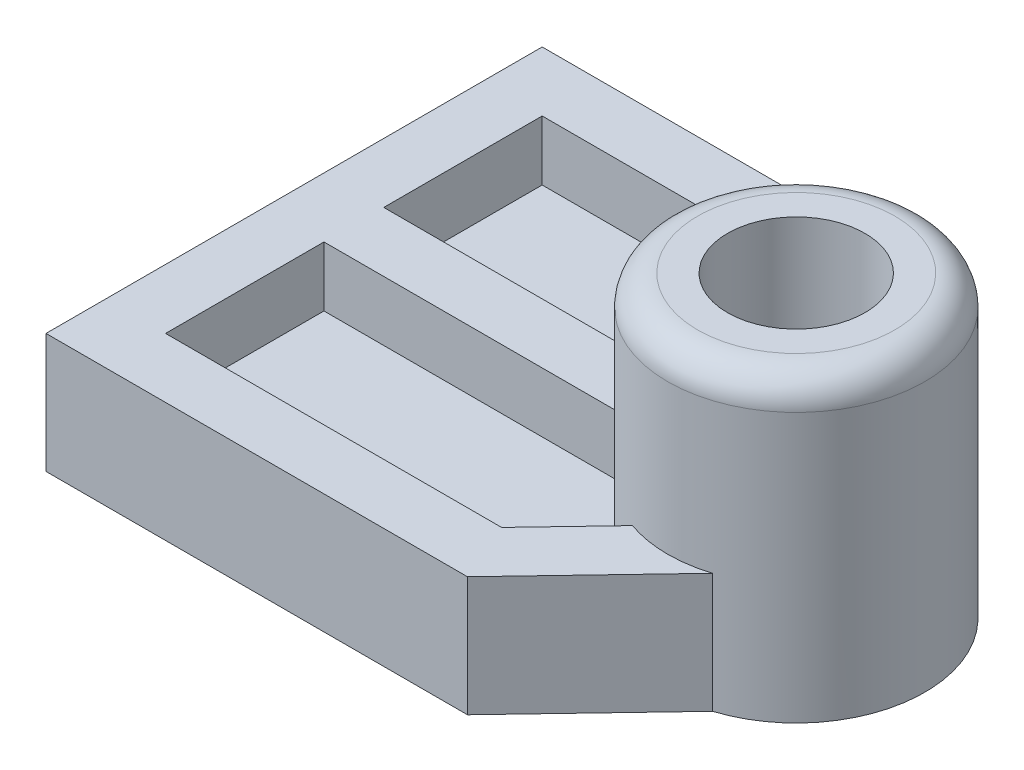
ISO-10303-21;
HEADER;
FILE_DESCRIPTION(('STEP AP214'),'2;1');
FILE_NAME('part.step','',(''),(''),'','','');
FILE_SCHEMA(('AUTOMOTIVE_DESIGN { 1 0 10303 214 1 1 1 1 }'));
ENDSEC;
DATA;
#1=APPLICATION_CONTEXT('core data for automotive mechanical design processes');
#2=APPLICATION_PROTOCOL_DEFINITION('international standard','automotive_design',2000,#1);
#3=PRODUCT_CONTEXT('',#1,'mechanical');
#4=PRODUCT('Part','Part','',(#3));
#5=PRODUCT_RELATED_PRODUCT_CATEGORY('part','',(#4));
#6=PRODUCT_DEFINITION_FORMATION('','',#4);
#7=PRODUCT_DEFINITION_CONTEXT('part definition',#1,'design');
#8=PRODUCT_DEFINITION('design','',#6,#7);
#9=PRODUCT_DEFINITION_SHAPE('','',#8);
#10=(LENGTH_UNIT() NAMED_UNIT(*) SI_UNIT(.MILLI.,.METRE.));
#11=(NAMED_UNIT(*) PLANE_ANGLE_UNIT() SI_UNIT($,.RADIAN.));
#12=(NAMED_UNIT(*) SI_UNIT($,.STERADIAN.) SOLID_ANGLE_UNIT());
#13=UNCERTAINTY_MEASURE_WITH_UNIT(LENGTH_MEASURE(1.E-05),#10,'distance_accuracy_value','');
#14=(GEOMETRIC_REPRESENTATION_CONTEXT(3) GLOBAL_UNCERTAINTY_ASSIGNED_CONTEXT((#13)) GLOBAL_UNIT_ASSIGNED_CONTEXT((#10,
#11,#12)) REPRESENTATION_CONTEXT('',''));
#15=CARTESIAN_POINT('',(0.,0.,0.));
#16=DIRECTION('',(0.,0.,1.));
#17=DIRECTION('',(1.,0.,0.));
#18=AXIS2_PLACEMENT_3D('',#15,#16,#17);
#19=CARTESIAN_POINT('',(0.,2.,0.));
#20=DIRECTION('',(0.,1.,0.));
#21=DIRECTION('',(0.,0.,1.));
#22=AXIS2_PLACEMENT_3D('',#19,#20,#21);
#23=PLANE('',#22);
#24=CARTESIAN_POINT('',(3.1,2.,0.));
#25=DIRECTION('',(0.,1.,0.));
#26=DIRECTION('',(0.,0.,1.));
#27=AXIS2_PLACEMENT_3D('',#24,#25,#26);
#28=CIRCLE('',#27,2.15);
#29=CARTESIAN_POINT('',(1.00894763336735,2.,-0.499999999999999));
#30=VERTEX_POINT('',#29);
#31=CARTESIAN_POINT('',(1.00894763336735,2.,0.499999999999999));
#32=VERTEX_POINT('',#31);
#33=EDGE_CURVE('E235',#30,#32,#28,.T.);
#34=ORIENTED_EDGE('',*,*,#33,.F.);
#35=DIRECTION('',(-1.,0.,0.));
#36=VECTOR('',#35,1.);
#37=CARTESIAN_POINT('',(0.,2.,-0.5));
#38=LINE('',#37,#36);
#39=CARTESIAN_POINT('',(-4.3,2.,-0.499999999999999));
#40=VERTEX_POINT('',#39);
#41=EDGE_CURVE('E56',#30,#40,#38,.T.);
#42=ORIENTED_EDGE('',*,*,#41,.T.);
#43=DIRECTION('',(0.,0.,1.));
#44=VECTOR('',#43,1.);
#45=CARTESIAN_POINT('',(-4.3,2.,0.));
#46=LINE('',#45,#44);
#47=CARTESIAN_POINT('',(-4.3,2.,-3.15));
#48=VERTEX_POINT('',#47);
#49=EDGE_CURVE('E163',#48,#40,#46,.T.);
#50=ORIENTED_EDGE('',*,*,#49,.F.);
#51=DIRECTION('',(1.,0.,0.));
#52=VECTOR('',#51,1.);
#53=CARTESIAN_POINT('',(0.,2.,-3.15));
#54=LINE('',#53,#52);
#55=CARTESIAN_POINT('',(1.32175815821047,2.,-3.15));
#56=VERTEX_POINT('',#55);
#57=EDGE_CURVE('E181',#48,#56,#54,.T.);
#58=ORIENTED_EDGE('',*,*,#57,.T.);
#59=DIRECTION('',(0.689550160177991,0.,0.724237928168987));
#60=VECTOR('',#59,1.);
#61=CARTESIAN_POINT('',(2.26639424630242,2.,-2.15784406585188));
#62=LINE('',#61,#60);
#63=CARTESIAN_POINT('',(2.38902615278775,2.,-2.02904317070392));
#64=VERTEX_POINT('',#63);
#65=EDGE_CURVE('E177',#56,#64,#62,.T.);
#66=ORIENTED_EDGE('',*,*,#65,.T.);
#67=CARTESIAN_POINT('',(3.75,2.,-2.04939015319192));
#68=VERTEX_POINT('',#67);
#69=EDGE_CURVE('E232',#68,#64,#28,.T.);
#70=ORIENTED_EDGE('',*,*,#69,.F.);
#71=DIRECTION('',(-0.689550160177991,0.,-0.724237928168987));
#72=VECTOR('',#71,1.);
#73=CARTESIAN_POINT('',(2.99041428345738,2.,-2.84718677102402));
#74=LINE('',#73,#72);
#75=CARTESIAN_POINT('',(1.75,2.,-4.15));
#76=VERTEX_POINT('',#75);
#77=EDGE_CURVE('E234',#68,#76,#74,.T.);
#78=ORIENTED_EDGE('',*,*,#77,.T.);
#79=DIRECTION('',(-1.,0.,0.));
#80=VECTOR('',#79,1.);
#81=CARTESIAN_POINT('',(0.,2.,-4.15));
#82=LINE('',#81,#80);
#83=CARTESIAN_POINT('',(-5.3,2.,-4.15));
#84=VERTEX_POINT('',#83);
#85=EDGE_CURVE('E237',#76,#84,#82,.T.);
#86=ORIENTED_EDGE('',*,*,#85,.T.);
#87=DIRECTION('',(0.,0.,1.));
#88=VECTOR('',#87,1.);
#89=CARTESIAN_POINT('',(-5.3,2.,0.));
#90=LINE('',#89,#88);
#91=CARTESIAN_POINT('',(-5.3,2.,4.15));
#92=VERTEX_POINT('',#91);
#93=EDGE_CURVE('E239',#84,#92,#90,.T.);
#94=ORIENTED_EDGE('',*,*,#93,.T.);
#95=DIRECTION('',(1.,0.,0.));
#96=VECTOR('',#95,1.);
#97=CARTESIAN_POINT('',(0.,2.,4.15));
#98=LINE('',#97,#96);
#99=CARTESIAN_POINT('',(1.75,2.,4.15));
#100=VERTEX_POINT('',#99);
#101=EDGE_CURVE('E241',#92,#100,#98,.T.);
#102=ORIENTED_EDGE('',*,*,#101,.T.);
#103=DIRECTION('',(0.689550160177991,0.,-0.724237928168987));
#104=VECTOR('',#103,1.);
#105=CARTESIAN_POINT('',(2.99041428345738,2.,2.84718677102402));
#106=LINE('',#105,#104);
#107=CARTESIAN_POINT('',(3.75,2.,2.04939015319192));
#108=VERTEX_POINT('',#107);
#109=EDGE_CURVE('E243',#100,#108,#106,.T.);
#110=ORIENTED_EDGE('',*,*,#109,.T.);
#111=CARTESIAN_POINT('',(2.38902615278775,2.,2.02904317070392));
#112=VERTEX_POINT('',#111);
#113=EDGE_CURVE('E229',#112,#108,#28,.T.);
#114=ORIENTED_EDGE('',*,*,#113,.F.);
#115=DIRECTION('',(0.689550160177991,0.,-0.724237928168988));
#116=VECTOR('',#115,1.);
#117=CARTESIAN_POINT('',(2.26639424630242,2.,2.15784406585188));
#118=LINE('',#117,#116);
#119=CARTESIAN_POINT('',(1.32175815821047,2.,3.15));
#120=VERTEX_POINT('',#119);
#121=EDGE_CURVE('E197',#120,#112,#118,.T.);
#122=ORIENTED_EDGE('',*,*,#121,.F.);
#123=DIRECTION('',(-1.,0.,0.));
#124=VECTOR('',#123,1.);
#125=CARTESIAN_POINT('',(0.,2.,3.15));
#126=LINE('',#125,#124);
#127=CARTESIAN_POINT('',(-4.3,2.,3.15));
#128=VERTEX_POINT('',#127);
#129=EDGE_CURVE('E213',#120,#128,#126,.T.);
#130=ORIENTED_EDGE('',*,*,#129,.T.);
#131=DIRECTION('',(0.,0.,1.));
#132=VECTOR('',#131,1.);
#133=CARTESIAN_POINT('',(-4.3,2.,0.));
#134=LINE('',#133,#132);
#135=CARTESIAN_POINT('',(-4.3,2.,0.500000000000001));
#136=VERTEX_POINT('',#135);
#137=EDGE_CURVE('E210',#136,#128,#134,.T.);
#138=ORIENTED_EDGE('',*,*,#137,.F.);
#139=DIRECTION('',(1.,0.,0.));
#140=VECTOR('',#139,1.);
#141=CARTESIAN_POINT('',(0.,2.,0.499999999999999));
#142=LINE('',#141,#140);
#143=EDGE_CURVE('E48',#136,#32,#142,.T.);
#144=ORIENTED_EDGE('',*,*,#143,.T.);
#145=EDGE_LOOP('',(#34,#42,#50,#58,#66,#70,#78,#86,#94,#102,#110,#114,#122,#130,#138,#144));
#146=FACE_BOUND('',#145,.T.);
#147=ADVANCED_FACE('F33',(#146),#23,.T.);
#148=CARTESIAN_POINT('',(0.,5.,0.));
#149=DIRECTION('',(0.,1.,0.));
#150=DIRECTION('',(0.,0.,1.));
#151=AXIS2_PLACEMENT_3D('',#148,#149,#150);
#152=PLANE('',#151);
#153=CARTESIAN_POINT('',(3.1,5.,0.));
#154=DIRECTION('',(0.,1.,0.));
#155=DIRECTION('',(0.,0.,1.));
#156=AXIS2_PLACEMENT_3D('',#153,#154,#155);
#157=CIRCLE('',#156,1.65);
#158=CARTESIAN_POINT('',(3.1,5.,1.65));
#159=VERTEX_POINT('',#158);
#160=EDGE_CURVE('E41',#159,#159,#157,.T.);
#161=ORIENTED_EDGE('',*,*,#160,.T.);
#162=EDGE_LOOP('',(#161));
#163=FACE_BOUND('',#162,.T.);
#164=CARTESIAN_POINT('',(3.1,5.,0.));
#165=DIRECTION('',(0.,1.,0.));
#166=DIRECTION('',(0.,0.,1.));
#167=AXIS2_PLACEMENT_3D('',#164,#165,#166);
#168=CIRCLE('',#167,1.15);
#169=CARTESIAN_POINT('',(3.1,5.,1.15));
#170=VERTEX_POINT('',#169);
#171=EDGE_CURVE('E188',#170,#170,#168,.T.);
#172=ORIENTED_EDGE('',*,*,#171,.F.);
#173=EDGE_LOOP('',(#172));
#174=FACE_BOUND('',#173,.T.);
#175=ADVANCED_FACE('F281',(#163,#174),#152,.T.);
#176=CARTESIAN_POINT('',(-5.25,5.,4.15));
#177=DIRECTION('',(0.,0.,-1.));
#178=DIRECTION('',(-1.,0.,0.));
#179=AXIS2_PLACEMENT_3D('',#176,#177,#178);
#180=PLANE('',#179);
#181=ORIENTED_EDGE('',*,*,#101,.F.);
#182=DIRECTION('',(0.,1.,0.));
#183=VECTOR('',#182,1.);
#184=CARTESIAN_POINT('',(-5.3,0.,4.15));
#185=LINE('',#184,#183);
#186=CARTESIAN_POINT('',(-5.3,0.,4.15));
#187=VERTEX_POINT('',#186);
#188=EDGE_CURVE('E251',#187,#92,#185,.T.);
#189=ORIENTED_EDGE('',*,*,#188,.F.);
#190=DIRECTION('',(1.,0.,0.));
#191=VECTOR('',#190,1.);
#192=CARTESIAN_POINT('',(-5.25,0.,4.15));
#193=LINE('',#192,#191);
#194=CARTESIAN_POINT('',(1.75,0.,4.15));
#195=VERTEX_POINT('',#194);
#196=EDGE_CURVE('E269',#187,#195,#193,.T.);
#197=ORIENTED_EDGE('',*,*,#196,.T.);
#198=DIRECTION('',(0.,-1.,0.));
#199=VECTOR('',#198,1.);
#200=CARTESIAN_POINT('',(1.75,5.,4.15));
#201=LINE('',#200,#199);
#202=EDGE_CURVE('E277',#100,#195,#201,.T.);
#203=ORIENTED_EDGE('',*,*,#202,.F.);
#204=EDGE_LOOP('',(#181,#189,#197,#203));
#205=FACE_BOUND('',#204,.T.);
#206=ADVANCED_FACE('F298',(#205),#180,.F.);
#207=CARTESIAN_POINT('',(-5.25,5.,-4.15));
#208=DIRECTION('',(0.,0.,1.));
#209=DIRECTION('',(1.,0.,0.));
#210=AXIS2_PLACEMENT_3D('',#207,#208,#209);
#211=PLANE('',#210);
#212=ORIENTED_EDGE('',*,*,#85,.F.);
#213=DIRECTION('',(0.,1.,0.));
#214=VECTOR('',#213,1.);
#215=CARTESIAN_POINT('',(1.75,-5.,-4.15));
#216=LINE('',#215,#214);
#217=CARTESIAN_POINT('',(1.75,0.,-4.15));
#218=VERTEX_POINT('',#217);
#219=EDGE_CURVE('E260',#218,#76,#216,.T.);
#220=ORIENTED_EDGE('',*,*,#219,.F.);
#221=DIRECTION('',(-1.,0.,0.));
#222=VECTOR('',#221,1.);
#223=CARTESIAN_POINT('',(-5.25,0.,-4.15));
#224=LINE('',#223,#222);
#225=CARTESIAN_POINT('',(-5.3,0.,-4.15));
#226=VERTEX_POINT('',#225);
#227=EDGE_CURVE('E264',#218,#226,#224,.T.);
#228=ORIENTED_EDGE('',*,*,#227,.T.);
#229=DIRECTION('',(0.,-1.,0.));
#230=VECTOR('',#229,1.);
#231=CARTESIAN_POINT('',(-5.3,0.,-4.15));
#232=LINE('',#231,#230);
#233=EDGE_CURVE('E246',#84,#226,#232,.T.);
#234=ORIENTED_EDGE('',*,*,#233,.F.);
#235=EDGE_LOOP('',(#212,#220,#228,#234));
#236=FACE_BOUND('',#235,.T.);
#237=ADVANCED_FACE('F316',(#236),#211,.F.);
#238=CARTESIAN_POINT('',(2.99041428345738,-5.,-2.84718677102402));
#239=DIRECTION('',(-0.724237928168987,0.,0.689550160177991));
#240=DIRECTION('',(0.689550160177991,0.,0.724237928168987));
#241=AXIS2_PLACEMENT_3D('',#238,#239,#240);
#242=PLANE('',#241);
#243=ORIENTED_EDGE('',*,*,#77,.F.);
#244=DIRECTION('',(0.,1.,0.));
#245=VECTOR('',#244,1.);
#246=CARTESIAN_POINT('',(3.75,-5.,-2.04939015319192));
#247=LINE('',#246,#245);
#248=CARTESIAN_POINT('',(3.75,0.,-2.04939015319192));
#249=VERTEX_POINT('',#248);
#250=EDGE_CURVE('E261',#249,#68,#247,.T.);
#251=ORIENTED_EDGE('',*,*,#250,.F.);
#252=DIRECTION('',(0.689550160177991,0.,0.724237928168987));
#253=VECTOR('',#252,1.);
#254=CARTESIAN_POINT('',(2.99041428345738,0.,-2.84718677102402));
#255=LINE('',#254,#253);
#256=EDGE_CURVE('E272',#218,#249,#255,.T.);
#257=ORIENTED_EDGE('',*,*,#256,.F.);
#258=ORIENTED_EDGE('',*,*,#219,.T.);
#259=EDGE_LOOP('',(#243,#251,#257,#258));
#260=FACE_BOUND('',#259,.T.);
#261=ADVANCED_FACE('F312',(#260),#242,.F.);
#262=CARTESIAN_POINT('',(2.99041428345738,-5.,2.84718677102402));
#263=DIRECTION('',(0.724237928168987,0.,0.689550160177991));
#264=DIRECTION('',(0.689550160177991,0.,-0.724237928168987));
#265=AXIS2_PLACEMENT_3D('',#262,#263,#264);
#266=PLANE('',#265);
#267=DIRECTION('',(0.,1.,0.));
#268=VECTOR('',#267,1.);
#269=CARTESIAN_POINT('',(3.75,-5.,2.04939015319192));
#270=LINE('',#269,#268);
#271=CARTESIAN_POINT('',(3.75,0.,2.04939015319192));
#272=VERTEX_POINT('',#271);
#273=EDGE_CURVE('E254',#272,#108,#270,.T.);
#274=ORIENTED_EDGE('',*,*,#273,.T.);
#275=ORIENTED_EDGE('',*,*,#109,.F.);
#276=ORIENTED_EDGE('',*,*,#202,.T.);
#277=DIRECTION('',(0.689550160177991,0.,-0.724237928168987));
#278=VECTOR('',#277,1.);
#279=CARTESIAN_POINT('',(2.99041428345738,0.,2.84718677102402));
#280=LINE('',#279,#278);
#281=EDGE_CURVE('E257',#195,#272,#280,.T.);
#282=ORIENTED_EDGE('',*,*,#281,.T.);
#283=EDGE_LOOP('',(#274,#275,#276,#282));
#284=FACE_BOUND('',#283,.T.);
#285=ADVANCED_FACE('F308',(#284),#266,.T.);
#286=CARTESIAN_POINT('',(-5.3,0.,0.));
#287=DIRECTION('',(1.,0.,0.));
#288=DIRECTION('',(0.,0.,-1.));
#289=AXIS2_PLACEMENT_3D('',#286,#287,#288);
#290=PLANE('',#289);
#291=ORIENTED_EDGE('',*,*,#93,.F.);
#292=ORIENTED_EDGE('',*,*,#233,.T.);
#293=DIRECTION('',(0.,0.,1.));
#294=VECTOR('',#293,1.);
#295=CARTESIAN_POINT('',(-5.3,0.,-4.15));
#296=LINE('',#295,#294);
#297=EDGE_CURVE('E248',#226,#187,#296,.T.);
#298=ORIENTED_EDGE('',*,*,#297,.T.);
#299=ORIENTED_EDGE('',*,*,#188,.T.);
#300=EDGE_LOOP('',(#291,#292,#298,#299));
#301=FACE_BOUND('',#300,.T.);
#302=ADVANCED_FACE('F304',(#301),#290,.F.);
#303=CARTESIAN_POINT('',(0.,0.,0.));
#304=DIRECTION('',(0.,1.,0.));
#305=DIRECTION('',(0.,0.,1.));
#306=AXIS2_PLACEMENT_3D('',#303,#304,#305);
#307=PLANE('',#306);
#308=CARTESIAN_POINT('',(3.1,0.,0.));
#309=DIRECTION('',(0.,1.,0.));
#310=DIRECTION('',(0.,0.,1.));
#311=AXIS2_PLACEMENT_3D('',#308,#309,#310);
#312=CIRCLE('',#311,1.15);
#313=CARTESIAN_POINT('',(3.1,0.,1.15));
#314=VERTEX_POINT('',#313);
#315=EDGE_CURVE('E226',#314,#314,#312,.T.);
#316=ORIENTED_EDGE('',*,*,#315,.T.);
#317=EDGE_LOOP('',(#316));
#318=FACE_BOUND('',#317,.T.);
#319=CARTESIAN_POINT('',(3.1,0.,0.));
#320=DIRECTION('',(0.,1.,0.));
#321=DIRECTION('',(0.,0.,1.));
#322=AXIS2_PLACEMENT_3D('',#319,#320,#321);
#323=CIRCLE('',#322,2.15);
#324=EDGE_CURVE('E275',#272,#249,#323,.T.);
#325=ORIENTED_EDGE('',*,*,#324,.F.);
#326=ORIENTED_EDGE('',*,*,#281,.F.);
#327=ORIENTED_EDGE('',*,*,#196,.F.);
#328=ORIENTED_EDGE('',*,*,#297,.F.);
#329=ORIENTED_EDGE('',*,*,#227,.F.);
#330=ORIENTED_EDGE('',*,*,#256,.T.);
#331=EDGE_LOOP('',(#325,#326,#327,#328,#329,#330));
#332=FACE_BOUND('',#331,.T.);
#333=ADVANCED_FACE('F307',(#318,#332),#307,.F.);
#334=CARTESIAN_POINT('',(3.1,-5.,0.));
#335=DIRECTION('',(0.,1.,0.));
#336=DIRECTION('',(0.,0.,1.));
#337=AXIS2_PLACEMENT_3D('',#334,#335,#336);
#338=CYLINDRICAL_SURFACE('',#337,2.15);
#339=CARTESIAN_POINT('',(3.1,4.5,0.));
#340=DIRECTION('',(0.,1.,0.));
#341=DIRECTION('',(0.,0.,1.));
#342=AXIS2_PLACEMENT_3D('',#339,#340,#341);
#343=CIRCLE('',#342,2.15);
#344=CARTESIAN_POINT('',(3.1,4.5,2.15));
#345=VERTEX_POINT('',#344);
#346=EDGE_CURVE('E11',#345,#345,#343,.F.);
#347=ORIENTED_EDGE('',*,*,#346,.T.);
#348=EDGE_LOOP('',(#347));
#349=FACE_BOUND('',#348,.T.);
#350=ORIENTED_EDGE('',*,*,#324,.T.);
#351=ORIENTED_EDGE('',*,*,#250,.T.);
#352=ORIENTED_EDGE('',*,*,#69,.T.);
#353=DIRECTION('',(0.,1.,0.));
#354=VECTOR('',#353,1.);
#355=CARTESIAN_POINT('',(2.38902615278775,1.,-2.02904317070392));
#356=LINE('',#355,#354);
#357=CARTESIAN_POINT('',(2.38902615278775,1.,-2.02904317070392));
#358=VERTEX_POINT('',#357);
#359=EDGE_CURVE('E152',#358,#64,#356,.T.);
#360=ORIENTED_EDGE('',*,*,#359,.F.);
#361=CARTESIAN_POINT('',(3.1,1.,0.));
#362=DIRECTION('',(0.,1.,0.));
#363=DIRECTION('',(0.,0.,1.));
#364=AXIS2_PLACEMENT_3D('',#361,#362,#363);
#365=CIRCLE('',#364,2.15);
#366=CARTESIAN_POINT('',(1.00894763336735,1.,-0.499999999999999));
#367=VERTEX_POINT('',#366);
#368=EDGE_CURVE('E160',#367,#358,#365,.F.);
#369=ORIENTED_EDGE('',*,*,#368,.F.);
#370=DIRECTION('',(0.,1.,0.));
#371=VECTOR('',#370,1.);
#372=CARTESIAN_POINT('',(1.00894763336735,1.,-0.499999999999999));
#373=LINE('',#372,#371);
#374=EDGE_CURVE('E143',#367,#30,#373,.T.);
#375=ORIENTED_EDGE('',*,*,#374,.T.);
#376=ORIENTED_EDGE('',*,*,#33,.T.);
#377=DIRECTION('',(0.,1.,0.));
#378=VECTOR('',#377,1.);
#379=CARTESIAN_POINT('',(1.00894763336735,1.,0.499999999999999));
#380=LINE('',#379,#378);
#381=CARTESIAN_POINT('',(1.00894763336735,1.,0.499999999999999));
#382=VERTEX_POINT('',#381);
#383=EDGE_CURVE('E178',#382,#32,#380,.T.);
#384=ORIENTED_EDGE('',*,*,#383,.F.);
#385=CARTESIAN_POINT('',(3.1,1.,0.));
#386=DIRECTION('',(0.,1.,0.));
#387=DIRECTION('',(0.,0.,1.));
#388=AXIS2_PLACEMENT_3D('',#385,#386,#387);
#389=CIRCLE('',#388,2.15);
#390=CARTESIAN_POINT('',(2.38902615278775,1.,2.02904317070392));
#391=VERTEX_POINT('',#390);
#392=EDGE_CURVE('E205',#391,#382,#389,.F.);
#393=ORIENTED_EDGE('',*,*,#392,.F.);
#394=DIRECTION('',(0.,1.,0.));
#395=VECTOR('',#394,1.);
#396=CARTESIAN_POINT('',(2.38902615278775,1.,2.02904317070392));
#397=LINE('',#396,#395);
#398=EDGE_CURVE('E219',#391,#112,#397,.T.);
#399=ORIENTED_EDGE('',*,*,#398,.T.);
#400=ORIENTED_EDGE('',*,*,#113,.T.);
#401=ORIENTED_EDGE('',*,*,#273,.F.);
#402=EDGE_LOOP('',(#350,#351,#352,#360,#369,#375,#376,#384,#393,#399,#400,#401));
#403=FACE_BOUND('',#402,.T.);
#404=ADVANCED_FACE('F167',(#349,#403),#338,.T.);
#405=CARTESIAN_POINT('',(3.1,0.,0.));
#406=DIRECTION('',(0.,1.,0.));
#407=DIRECTION('',(0.,0.,1.));
#408=AXIS2_PLACEMENT_3D('',#405,#406,#407);
#409=CYLINDRICAL_SURFACE('',#408,1.15);
#410=ORIENTED_EDGE('',*,*,#315,.F.);
#411=EDGE_LOOP('',(#410));
#412=FACE_BOUND('',#411,.T.);
#413=ORIENTED_EDGE('',*,*,#171,.T.);
#414=EDGE_LOOP('',(#413));
#415=FACE_BOUND('',#414,.T.);
#416=ADVANCED_FACE('F302',(#412,#415),#409,.F.);
#417=CARTESIAN_POINT('',(0.,1.,0.499999999999999));
#418=DIRECTION('',(0.,0.,1.));
#419=DIRECTION('',(1.,0.,0.));
#420=AXIS2_PLACEMENT_3D('',#417,#418,#419);
#421=PLANE('',#420);
#422=ORIENTED_EDGE('',*,*,#143,.F.);
#423=DIRECTION('',(0.,1.,0.));
#424=VECTOR('',#423,1.);
#425=CARTESIAN_POINT('',(-4.3,1.,0.500000000000001));
#426=LINE('',#425,#424);
#427=CARTESIAN_POINT('',(-4.3,1.,0.500000000000001));
#428=VERTEX_POINT('',#427);
#429=EDGE_CURVE('E208',#428,#136,#426,.T.);
#430=ORIENTED_EDGE('',*,*,#429,.F.);
#431=DIRECTION('',(1.,0.,0.));
#432=VECTOR('',#431,1.);
#433=CARTESIAN_POINT('',(0.,1.,0.499999999999999));
#434=LINE('',#433,#432);
#435=EDGE_CURVE('E194',#428,#382,#434,.T.);
#436=ORIENTED_EDGE('',*,*,#435,.T.);
#437=ORIENTED_EDGE('',*,*,#383,.T.);
#438=EDGE_LOOP('',(#422,#430,#436,#437));
#439=FACE_BOUND('',#438,.T.);
#440=ADVANCED_FACE('F356',(#439),#421,.T.);
#441=CARTESIAN_POINT('',(2.26639424630242,1.,2.15784406585188));
#442=DIRECTION('',(0.724237928168988,0.,0.689550160177991));
#443=DIRECTION('',(0.689550160177991,0.,-0.724237928168988));
#444=AXIS2_PLACEMENT_3D('',#441,#442,#443);
#445=PLANE('',#444);
#446=ORIENTED_EDGE('',*,*,#121,.T.);
#447=ORIENTED_EDGE('',*,*,#398,.F.);
#448=DIRECTION('',(0.689550160177991,0.,-0.724237928168988));
#449=VECTOR('',#448,1.);
#450=CARTESIAN_POINT('',(2.26639424630242,1.,2.15784406585188));
#451=LINE('',#450,#449);
#452=CARTESIAN_POINT('',(1.32175815821047,1.,3.15));
#453=VERTEX_POINT('',#452);
#454=EDGE_CURVE('E202',#453,#391,#451,.T.);
#455=ORIENTED_EDGE('',*,*,#454,.F.);
#456=DIRECTION('',(0.,1.,0.));
#457=VECTOR('',#456,1.);
#458=CARTESIAN_POINT('',(1.32175815821047,1.,3.15));
#459=LINE('',#458,#457);
#460=EDGE_CURVE('E221',#453,#120,#459,.T.);
#461=ORIENTED_EDGE('',*,*,#460,.T.);
#462=EDGE_LOOP('',(#446,#447,#455,#461));
#463=FACE_BOUND('',#462,.T.);
#464=ADVANCED_FACE('F362',(#463),#445,.F.);
#465=CARTESIAN_POINT('',(0.,1.,3.15));
#466=DIRECTION('',(0.,0.,-1.));
#467=DIRECTION('',(-1.,0.,0.));
#468=AXIS2_PLACEMENT_3D('',#465,#466,#467);
#469=PLANE('',#468);
#470=ORIENTED_EDGE('',*,*,#129,.F.);
#471=ORIENTED_EDGE('',*,*,#460,.F.);
#472=DIRECTION('',(-1.,0.,0.));
#473=VECTOR('',#472,1.);
#474=CARTESIAN_POINT('',(0.,1.,3.15));
#475=LINE('',#474,#473);
#476=CARTESIAN_POINT('',(-4.3,1.,3.15));
#477=VERTEX_POINT('',#476);
#478=EDGE_CURVE('E200',#453,#477,#475,.T.);
#479=ORIENTED_EDGE('',*,*,#478,.T.);
#480=DIRECTION('',(0.,1.,0.));
#481=VECTOR('',#480,1.);
#482=CARTESIAN_POINT('',(-4.3,1.,3.15));
#483=LINE('',#482,#481);
#484=EDGE_CURVE('E223',#477,#128,#483,.T.);
#485=ORIENTED_EDGE('',*,*,#484,.T.);
#486=EDGE_LOOP('',(#470,#471,#479,#485));
#487=FACE_BOUND('',#486,.T.);
#488=ADVANCED_FACE('F364',(#487),#469,.T.);
#489=CARTESIAN_POINT('',(-4.3,1.,0.));
#490=DIRECTION('',(-1.,0.,0.));
#491=DIRECTION('',(0.,0.,1.));
#492=AXIS2_PLACEMENT_3D('',#489,#490,#491);
#493=PLANE('',#492);
#494=ORIENTED_EDGE('',*,*,#137,.T.);
#495=ORIENTED_EDGE('',*,*,#484,.F.);
#496=DIRECTION('',(0.,0.,1.));
#497=VECTOR('',#496,1.);
#498=CARTESIAN_POINT('',(-4.3,1.,0.));
#499=LINE('',#498,#497);
#500=EDGE_CURVE('E196',#428,#477,#499,.T.);
#501=ORIENTED_EDGE('',*,*,#500,.F.);
#502=ORIENTED_EDGE('',*,*,#429,.T.);
#503=EDGE_LOOP('',(#494,#495,#501,#502));
#504=FACE_BOUND('',#503,.T.);
#505=ADVANCED_FACE('F353',(#504),#493,.F.);
#506=CARTESIAN_POINT('',(0.,1.,0.));
#507=DIRECTION('',(0.,1.,0.));
#508=DIRECTION('',(0.,0.,1.));
#509=AXIS2_PLACEMENT_3D('',#506,#507,#508);
#510=PLANE('',#509);
#511=ORIENTED_EDGE('',*,*,#435,.F.);
#512=ORIENTED_EDGE('',*,*,#500,.T.);
#513=ORIENTED_EDGE('',*,*,#478,.F.);
#514=ORIENTED_EDGE('',*,*,#454,.T.);
#515=ORIENTED_EDGE('',*,*,#392,.T.);
#516=EDGE_LOOP('',(#511,#512,#513,#514,#515));
#517=FACE_BOUND('',#516,.T.);
#518=ADVANCED_FACE('F358',(#517),#510,.T.);
#519=CARTESIAN_POINT('',(0.,1.,-0.5));
#520=DIRECTION('',(0.,0.,-1.));
#521=DIRECTION('',(-1.,0.,0.));
#522=AXIS2_PLACEMENT_3D('',#519,#520,#521);
#523=PLANE('',#522);
#524=ORIENTED_EDGE('',*,*,#41,.F.);
#525=ORIENTED_EDGE('',*,*,#374,.F.);
#526=DIRECTION('',(-1.,0.,0.));
#527=VECTOR('',#526,1.);
#528=CARTESIAN_POINT('',(0.,1.,-0.5));
#529=LINE('',#528,#527);
#530=CARTESIAN_POINT('',(-4.3,1.,-0.499999999999999));
#531=VERTEX_POINT('',#530);
#532=EDGE_CURVE('E146',#367,#531,#529,.T.);
#533=ORIENTED_EDGE('',*,*,#532,.T.);
#534=DIRECTION('',(0.,1.,0.));
#535=VECTOR('',#534,1.);
#536=CARTESIAN_POINT('',(-4.3,1.,-0.499999999999999));
#537=LINE('',#536,#535);
#538=EDGE_CURVE('E186',#531,#40,#537,.T.);
#539=ORIENTED_EDGE('',*,*,#538,.T.);
#540=EDGE_LOOP('',(#524,#525,#533,#539));
#541=FACE_BOUND('',#540,.T.);
#542=ADVANCED_FACE('F145',(#541),#523,.T.);
#543=CARTESIAN_POINT('',(-4.3,1.,0.));
#544=DIRECTION('',(-1.,0.,0.));
#545=DIRECTION('',(0.,0.,1.));
#546=AXIS2_PLACEMENT_3D('',#543,#544,#545);
#547=PLANE('',#546);
#548=ORIENTED_EDGE('',*,*,#49,.T.);
#549=ORIENTED_EDGE('',*,*,#538,.F.);
#550=DIRECTION('',(0.,0.,1.));
#551=VECTOR('',#550,1.);
#552=CARTESIAN_POINT('',(-4.3,1.,0.));
#553=LINE('',#552,#551);
#554=CARTESIAN_POINT('',(-4.3,1.,-3.15));
#555=VERTEX_POINT('',#554);
#556=EDGE_CURVE('E153',#555,#531,#553,.T.);
#557=ORIENTED_EDGE('',*,*,#556,.F.);
#558=DIRECTION('',(0.,1.,0.));
#559=VECTOR('',#558,1.);
#560=CARTESIAN_POINT('',(-4.3,1.,-3.15));
#561=LINE('',#560,#559);
#562=EDGE_CURVE('E189',#555,#48,#561,.T.);
#563=ORIENTED_EDGE('',*,*,#562,.T.);
#564=EDGE_LOOP('',(#548,#549,#557,#563));
#565=FACE_BOUND('',#564,.T.);
#566=ADVANCED_FACE('F450',(#565),#547,.F.);
#567=CARTESIAN_POINT('',(0.,1.,-3.15));
#568=DIRECTION('',(0.,0.,1.));
#569=DIRECTION('',(1.,0.,0.));
#570=AXIS2_PLACEMENT_3D('',#567,#568,#569);
#571=PLANE('',#570);
#572=ORIENTED_EDGE('',*,*,#57,.F.);
#573=ORIENTED_EDGE('',*,*,#562,.F.);
#574=DIRECTION('',(1.,0.,0.));
#575=VECTOR('',#574,1.);
#576=CARTESIAN_POINT('',(0.,1.,-3.15));
#577=LINE('',#576,#575);
#578=CARTESIAN_POINT('',(1.32175815821047,1.,-3.15));
#579=VERTEX_POINT('',#578);
#580=EDGE_CURVE('E171',#555,#579,#577,.T.);
#581=ORIENTED_EDGE('',*,*,#580,.T.);
#582=DIRECTION('',(0.,1.,0.));
#583=VECTOR('',#582,1.);
#584=CARTESIAN_POINT('',(1.32175815821047,1.,-3.15));
#585=LINE('',#584,#583);
#586=EDGE_CURVE('E191',#579,#56,#585,.T.);
#587=ORIENTED_EDGE('',*,*,#586,.T.);
#588=EDGE_LOOP('',(#572,#573,#581,#587));
#589=FACE_BOUND('',#588,.T.);
#590=ADVANCED_FACE('F440',(#589),#571,.T.);
#591=CARTESIAN_POINT('',(2.26639424630242,1.,-2.15784406585188));
#592=DIRECTION('',(-0.724237928168987,0.,0.689550160177991));
#593=DIRECTION('',(0.689550160177991,0.,0.724237928168987));
#594=AXIS2_PLACEMENT_3D('',#591,#592,#593);
#595=PLANE('',#594);
#596=ORIENTED_EDGE('',*,*,#65,.F.);
#597=ORIENTED_EDGE('',*,*,#586,.F.);
#598=DIRECTION('',(0.689550160177991,0.,0.724237928168987));
#599=VECTOR('',#598,1.);
#600=CARTESIAN_POINT('',(2.26639424630242,1.,-2.15784406585188));
#601=LINE('',#600,#599);
#602=EDGE_CURVE('E169',#579,#358,#601,.T.);
#603=ORIENTED_EDGE('',*,*,#602,.T.);
#604=ORIENTED_EDGE('',*,*,#359,.T.);
#605=EDGE_LOOP('',(#596,#597,#603,#604));
#606=FACE_BOUND('',#605,.T.);
#607=ADVANCED_FACE('F289',(#606),#595,.T.);
#608=CARTESIAN_POINT('',(0.,1.,0.));
#609=DIRECTION('',(0.,1.,0.));
#610=DIRECTION('',(0.,0.,1.));
#611=AXIS2_PLACEMENT_3D('',#608,#609,#610);
#612=PLANE('',#611);
#613=ORIENTED_EDGE('',*,*,#532,.F.);
#614=ORIENTED_EDGE('',*,*,#368,.T.);
#615=ORIENTED_EDGE('',*,*,#602,.F.);
#616=ORIENTED_EDGE('',*,*,#580,.F.);
#617=ORIENTED_EDGE('',*,*,#556,.T.);
#618=EDGE_LOOP('',(#613,#614,#615,#616,#617));
#619=FACE_BOUND('',#618,.T.);
#620=ADVANCED_FACE('F158',(#619),#612,.T.);
#621=CARTESIAN_POINT('',(3.1,4.5,0.));
#622=DIRECTION('',(0.,1.,0.));
#623=DIRECTION('',(0.,0.,1.));
#624=AXIS2_PLACEMENT_3D('',#621,#622,#623);
#625=TOROIDAL_SURFACE('',#624,1.65,0.5);
#626=ORIENTED_EDGE('',*,*,#346,.F.);
#627=EDGE_LOOP('',(#626));
#628=FACE_BOUND('',#627,.T.);
#629=ORIENTED_EDGE('',*,*,#160,.F.);
#630=EDGE_LOOP('',(#629));
#631=FACE_BOUND('',#630,.T.);
#632=ADVANCED_FACE('F35',(#628,#631),#625,.T.);
#633=CLOSED_SHELL('',(#147,#175,#206,#237,#261,#285,#302,#333,#404,#416,#440,#464,#488,#505,
#518,#542,#566,#590,#607,#620,#632));
#634=MANIFOLD_SOLID_BREP('B2',#633);
#635=ADVANCED_BREP_SHAPE_REPRESENTATION('',(#18,#634),#14);
#636=SHAPE_DEFINITION_REPRESENTATION(#9,#635);
ENDSEC;
END-ISO-10303-21;
